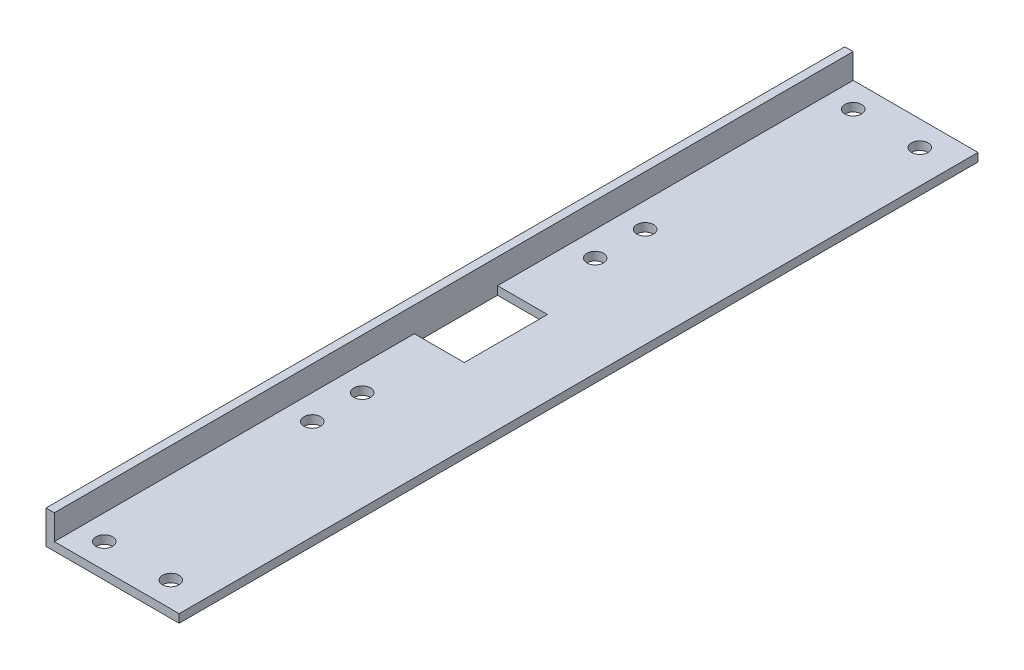
ISO-10303-21;
HEADER;
FILE_DESCRIPTION(('STEP AP214'),'2;1');
FILE_NAME('part.step','',(''),(''),'','','');
FILE_SCHEMA(('AUTOMOTIVE_DESIGN { 1 0 10303 214 1 1 1 1 }'));
ENDSEC;
DATA;
#1=APPLICATION_CONTEXT('core data for automotive mechanical design processes');
#2=APPLICATION_PROTOCOL_DEFINITION('international standard','automotive_design',2000,#1);
#3=PRODUCT_CONTEXT('',#1,'mechanical');
#4=PRODUCT('Part','Part','',(#3));
#5=PRODUCT_RELATED_PRODUCT_CATEGORY('part','',(#4));
#6=PRODUCT_DEFINITION_FORMATION('','',#4);
#7=PRODUCT_DEFINITION_CONTEXT('part definition',#1,'design');
#8=PRODUCT_DEFINITION('design','',#6,#7);
#9=PRODUCT_DEFINITION_SHAPE('','',#8);
#10=(LENGTH_UNIT() NAMED_UNIT(*) SI_UNIT(.MILLI.,.METRE.));
#11=(NAMED_UNIT(*) PLANE_ANGLE_UNIT() SI_UNIT($,.RADIAN.));
#12=(NAMED_UNIT(*) SI_UNIT($,.STERADIAN.) SOLID_ANGLE_UNIT());
#13=UNCERTAINTY_MEASURE_WITH_UNIT(LENGTH_MEASURE(1.E-05),#10,'distance_accuracy_value','');
#14=(GEOMETRIC_REPRESENTATION_CONTEXT(3) GLOBAL_UNCERTAINTY_ASSIGNED_CONTEXT((#13)) GLOBAL_UNIT_ASSIGNED_CONTEXT((#10,
#11,#12)) REPRESENTATION_CONTEXT('',''));
#15=CARTESIAN_POINT('',(0.,0.,0.));
#16=DIRECTION('',(0.,0.,1.));
#17=DIRECTION('',(1.,0.,0.));
#18=AXIS2_PLACEMENT_3D('',#15,#16,#17);
#19=CARTESIAN_POINT('',(3.175,3.17499999999999,304.8));
#20=DIRECTION('',(-1.,0.,0.));
#21=DIRECTION('',(0.,-1.,0.));
#22=AXIS2_PLACEMENT_3D('',#19,#20,#21);
#23=PLANE('',#22);
#24=DIRECTION('',(0.,1.,0.));
#25=VECTOR('',#24,1.);
#26=CARTESIAN_POINT('',(3.175,0.,0.));
#27=LINE('',#26,#25);
#28=CARTESIAN_POINT('',(3.175,3.175,0.));
#29=VERTEX_POINT('',#28);
#30=CARTESIAN_POINT('',(3.175,12.7,0.));
#31=VERTEX_POINT('',#30);
#32=EDGE_CURVE('E139',#29,#31,#27,.T.);
#33=ORIENTED_EDGE('',*,*,#32,.T.);
#34=DIRECTION('',(0.,0.,-1.));
#35=VECTOR('',#34,1.);
#36=CARTESIAN_POINT('',(3.175,12.7,0.));
#37=LINE('',#36,#35);
#38=CARTESIAN_POINT('',(3.175,12.7,304.8));
#39=VERTEX_POINT('',#38);
#40=EDGE_CURVE('E55',#39,#31,#37,.T.);
#41=ORIENTED_EDGE('',*,*,#40,.F.);
#42=DIRECTION('',(0.,1.,0.));
#43=VECTOR('',#42,1.);
#44=CARTESIAN_POINT('',(3.175,0.,304.8));
#45=LINE('',#44,#43);
#46=CARTESIAN_POINT('',(3.175,3.175,304.8));
#47=VERTEX_POINT('',#46);
#48=EDGE_CURVE('E160',#47,#39,#45,.T.);
#49=ORIENTED_EDGE('',*,*,#48,.F.);
#50=DIRECTION('',(0.,0.,1.));
#51=VECTOR('',#50,1.);
#52=CARTESIAN_POINT('',(3.175,3.17499999999999,304.8));
#53=LINE('',#52,#51);
#54=CARTESIAN_POINT('',(3.175,3.17499999999999,167.43393488));
#55=VERTEX_POINT('',#54);
#56=EDGE_CURVE('E168',#47,#55,#53,.F.);
#57=ORIENTED_EDGE('',*,*,#56,.T.);
#58=DIRECTION('',(0.,-1.,0.));
#59=VECTOR('',#58,1.);
#60=CARTESIAN_POINT('',(3.175,25.401,167.43393488));
#61=LINE('',#60,#59);
#62=CARTESIAN_POINT('',(3.175,0.,167.43393488));
#63=VERTEX_POINT('',#62);
#64=EDGE_CURVE('E63',#55,#63,#61,.T.);
#65=ORIENTED_EDGE('',*,*,#64,.T.);
#66=DIRECTION('',(0.,0.,-1.));
#67=VECTOR('',#66,1.);
#68=CARTESIAN_POINT('',(3.175,0.,167.43393488));
#69=LINE('',#68,#67);
#70=CARTESIAN_POINT('',(3.175,0.,135.68393488));
#71=VERTEX_POINT('',#70);
#72=EDGE_CURVE('E337',#63,#71,#69,.T.);
#73=ORIENTED_EDGE('',*,*,#72,.T.);
#74=DIRECTION('',(0.,-1.,0.));
#75=VECTOR('',#74,1.);
#76=CARTESIAN_POINT('',(3.175,25.401,135.68393488));
#77=LINE('',#76,#75);
#78=CARTESIAN_POINT('',(3.175,3.175,135.68393488));
#79=VERTEX_POINT('',#78);
#80=EDGE_CURVE('E310',#79,#71,#77,.T.);
#81=ORIENTED_EDGE('',*,*,#80,.F.);
#82=EDGE_CURVE('E170',#79,#29,#53,.F.);
#83=ORIENTED_EDGE('',*,*,#82,.T.);
#84=EDGE_LOOP('',(#33,#41,#49,#57,#65,#73,#81,#83));
#85=FACE_BOUND('',#84,.T.);
#86=ADVANCED_FACE('F39',(#85),#23,.F.);
#87=CARTESIAN_POINT('',(50.8,3.175,304.8));
#88=DIRECTION('',(0.,-1.,0.));
#89=DIRECTION('',(1.,0.,0.));
#90=AXIS2_PLACEMENT_3D('',#87,#88,#89);
#91=PLANE('',#90);
#92=CARTESIAN_POINT('',(38.1,3.175,295.275));
#93=DIRECTION('',(0.,-1.,0.));
#94=DIRECTION('',(0.,0.,-1.));
#95=AXIS2_PLACEMENT_3D('',#92,#93,#94);
#96=CIRCLE('',#95,3.17499999999998);
#97=CARTESIAN_POINT('',(38.1,3.175,292.1));
#98=VERTEX_POINT('',#97);
#99=EDGE_CURVE('E192',#98,#98,#96,.T.);
#100=ORIENTED_EDGE('',*,*,#99,.T.);
#101=EDGE_LOOP('',(#100));
#102=FACE_BOUND('',#101,.T.);
#103=CARTESIAN_POINT('',(12.7,3.175,295.275));
#104=DIRECTION('',(0.,-1.,0.));
#105=DIRECTION('',(0.,0.,-1.));
#106=AXIS2_PLACEMENT_3D('',#103,#104,#105);
#107=CIRCLE('',#106,3.17499999999998);
#108=CARTESIAN_POINT('',(12.7,3.175,292.1));
#109=VERTEX_POINT('',#108);
#110=EDGE_CURVE('E195',#109,#109,#107,.T.);
#111=ORIENTED_EDGE('',*,*,#110,.T.);
#112=EDGE_LOOP('',(#111));
#113=FACE_BOUND('',#112,.T.);
#114=CARTESIAN_POINT('',(12.7,3.175,196.85));
#115=DIRECTION('',(0.,-1.,0.));
#116=DIRECTION('',(0.,0.,-1.));
#117=AXIS2_PLACEMENT_3D('',#114,#115,#116);
#118=CIRCLE('',#117,3.17500000000001);
#119=CARTESIAN_POINT('',(12.7,3.175,193.675));
#120=VERTEX_POINT('',#119);
#121=EDGE_CURVE('E142',#120,#120,#118,.T.);
#122=ORIENTED_EDGE('',*,*,#121,.T.);
#123=EDGE_LOOP('',(#122));
#124=FACE_BOUND('',#123,.T.);
#125=CARTESIAN_POINT('',(12.7,3.175,215.9));
#126=DIRECTION('',(0.,-1.,0.));
#127=DIRECTION('',(0.,0.,-1.));
#128=AXIS2_PLACEMENT_3D('',#125,#126,#127);
#129=CIRCLE('',#128,3.17500000000001);
#130=CARTESIAN_POINT('',(12.7,3.175,212.725));
#131=VERTEX_POINT('',#130);
#132=EDGE_CURVE('E138',#131,#131,#129,.T.);
#133=ORIENTED_EDGE('',*,*,#132,.T.);
#134=EDGE_LOOP('',(#133));
#135=FACE_BOUND('',#134,.T.);
#136=ORIENTED_EDGE('',*,*,#82,.F.);
#137=DIRECTION('',(-1.,0.,0.));
#138=VECTOR('',#137,1.);
#139=CARTESIAN_POINT('',(3.175,3.17499999999999,135.68393488));
#140=LINE('',#139,#138);
#141=CARTESIAN_POINT('',(22.225,3.175,135.68393488));
#142=VERTEX_POINT('',#141);
#143=EDGE_CURVE('E304',#142,#79,#140,.T.);
#144=ORIENTED_EDGE('',*,*,#143,.F.);
#145=DIRECTION('',(0.,0.,-1.));
#146=VECTOR('',#145,1.);
#147=CARTESIAN_POINT('',(22.225,3.175,167.43393488));
#148=LINE('',#147,#146);
#149=CARTESIAN_POINT('',(22.225,3.175,167.43393488));
#150=VERTEX_POINT('',#149);
#151=EDGE_CURVE('E326',#150,#142,#148,.T.);
#152=ORIENTED_EDGE('',*,*,#151,.F.);
#153=DIRECTION('',(1.,0.,0.));
#154=VECTOR('',#153,1.);
#155=CARTESIAN_POINT('',(3.175,3.17499999999999,167.43393488));
#156=LINE('',#155,#154);
#157=EDGE_CURVE('E306',#55,#150,#156,.T.);
#158=ORIENTED_EDGE('',*,*,#157,.F.);
#159=ORIENTED_EDGE('',*,*,#56,.F.);
#160=DIRECTION('',(1.,0.,0.));
#161=VECTOR('',#160,1.);
#162=CARTESIAN_POINT('',(0.,3.175,304.8));
#163=LINE('',#162,#161);
#164=CARTESIAN_POINT('',(50.8,3.175,304.8));
#165=VERTEX_POINT('',#164);
#166=EDGE_CURVE('E163',#165,#47,#163,.F.);
#167=ORIENTED_EDGE('',*,*,#166,.F.);
#168=DIRECTION('',(0.,0.,1.));
#169=VECTOR('',#168,1.);
#170=CARTESIAN_POINT('',(50.8,3.175,304.8));
#171=LINE('',#170,#169);
#172=CARTESIAN_POINT('',(50.8,3.175,0.));
#173=VERTEX_POINT('',#172);
#174=EDGE_CURVE('E155',#165,#173,#171,.F.);
#175=ORIENTED_EDGE('',*,*,#174,.T.);
#176=DIRECTION('',(1.,0.,0.));
#177=VECTOR('',#176,1.);
#178=CARTESIAN_POINT('',(0.,3.175,0.));
#179=LINE('',#178,#177);
#180=EDGE_CURVE('E144',#173,#29,#179,.F.);
#181=ORIENTED_EDGE('',*,*,#180,.T.);
#182=EDGE_LOOP('',(#136,#144,#152,#158,#159,#167,#175,#181));
#183=FACE_BOUND('',#182,.T.);
#184=CARTESIAN_POINT('',(12.7,3.175,9.525));
#185=DIRECTION('',(0.,-1.,0.));
#186=DIRECTION('',(0.,0.,-1.));
#187=AXIS2_PLACEMENT_3D('',#184,#185,#186);
#188=CIRCLE('',#187,3.175);
#189=CARTESIAN_POINT('',(12.7,3.175,6.35));
#190=VERTEX_POINT('',#189);
#191=EDGE_CURVE('E167',#190,#190,#188,.T.);
#192=ORIENTED_EDGE('',*,*,#191,.T.);
#193=EDGE_LOOP('',(#192));
#194=FACE_BOUND('',#193,.T.);
#195=CARTESIAN_POINT('',(38.1,3.175,9.525));
#196=DIRECTION('',(0.,-1.,0.));
#197=DIRECTION('',(0.,0.,-1.));
#198=AXIS2_PLACEMENT_3D('',#195,#196,#197);
#199=CIRCLE('',#198,3.175);
#200=CARTESIAN_POINT('',(38.1,3.175,6.35000000000001));
#201=VERTEX_POINT('',#200);
#202=EDGE_CURVE('E202',#201,#201,#199,.T.);
#203=ORIENTED_EDGE('',*,*,#202,.T.);
#204=EDGE_LOOP('',(#203));
#205=FACE_BOUND('',#204,.T.);
#206=CARTESIAN_POINT('',(12.7,3.175,107.95));
#207=DIRECTION('',(0.,-1.,0.));
#208=DIRECTION('',(0.,0.,-1.));
#209=AXIS2_PLACEMENT_3D('',#206,#207,#208);
#210=CIRCLE('',#209,3.175);
#211=CARTESIAN_POINT('',(12.7,3.175,104.775));
#212=VERTEX_POINT('',#211);
#213=EDGE_CURVE('E204',#212,#212,#210,.T.);
#214=ORIENTED_EDGE('',*,*,#213,.T.);
#215=EDGE_LOOP('',(#214));
#216=FACE_BOUND('',#215,.T.);
#217=CARTESIAN_POINT('',(12.7,3.175,88.9));
#218=DIRECTION('',(0.,-1.,0.));
#219=DIRECTION('',(0.,0.,-1.));
#220=AXIS2_PLACEMENT_3D('',#217,#218,#219);
#221=CIRCLE('',#220,3.175);
#222=CARTESIAN_POINT('',(12.7,3.175,85.725));
#223=VERTEX_POINT('',#222);
#224=EDGE_CURVE('E42',#223,#223,#221,.T.);
#225=ORIENTED_EDGE('',*,*,#224,.T.);
#226=EDGE_LOOP('',(#225));
#227=FACE_BOUND('',#226,.T.);
#228=ADVANCED_FACE('F211',(#102,#113,#124,#135,#183,#194,#205,#216,#227),#91,.F.);
#229=CARTESIAN_POINT('',(12.7,25.4,88.9));
#230=DIRECTION('',(0.,-1.,0.));
#231=DIRECTION('',(0.,0.,-1.));
#232=AXIS2_PLACEMENT_3D('',#229,#230,#231);
#233=CYLINDRICAL_SURFACE('',#232,3.175);
#234=ORIENTED_EDGE('',*,*,#224,.F.);
#235=EDGE_LOOP('',(#234));
#236=FACE_BOUND('',#235,.T.);
#237=CARTESIAN_POINT('',(12.7,0.,88.9));
#238=DIRECTION('',(0.,-1.,0.));
#239=DIRECTION('',(0.,0.,-1.));
#240=AXIS2_PLACEMENT_3D('',#237,#238,#239);
#241=CIRCLE('',#240,3.175);
#242=CARTESIAN_POINT('',(12.7,0.,85.725));
#243=VERTEX_POINT('',#242);
#244=EDGE_CURVE('E189',#243,#243,#241,.T.);
#245=ORIENTED_EDGE('',*,*,#244,.T.);
#246=EDGE_LOOP('',(#245));
#247=FACE_BOUND('',#246,.T.);
#248=ADVANCED_FACE('F213',(#236,#247),#233,.F.);
#249=CARTESIAN_POINT('',(12.7,25.4,107.95));
#250=DIRECTION('',(0.,-1.,0.));
#251=DIRECTION('',(0.,0.,-1.));
#252=AXIS2_PLACEMENT_3D('',#249,#250,#251);
#253=CYLINDRICAL_SURFACE('',#252,3.175);
#254=ORIENTED_EDGE('',*,*,#213,.F.);
#255=EDGE_LOOP('',(#254));
#256=FACE_BOUND('',#255,.T.);
#257=CARTESIAN_POINT('',(12.7,0.,107.95));
#258=DIRECTION('',(0.,-1.,0.));
#259=DIRECTION('',(0.,0.,-1.));
#260=AXIS2_PLACEMENT_3D('',#257,#258,#259);
#261=CIRCLE('',#260,3.175);
#262=CARTESIAN_POINT('',(12.7,0.,104.775));
#263=VERTEX_POINT('',#262);
#264=EDGE_CURVE('E186',#263,#263,#261,.T.);
#265=ORIENTED_EDGE('',*,*,#264,.T.);
#266=EDGE_LOOP('',(#265));
#267=FACE_BOUND('',#266,.T.);
#268=ADVANCED_FACE('F216',(#256,#267),#253,.F.);
#269=CARTESIAN_POINT('',(38.1,25.4,9.525));
#270=DIRECTION('',(0.,-1.,0.));
#271=DIRECTION('',(0.,0.,-1.));
#272=AXIS2_PLACEMENT_3D('',#269,#270,#271);
#273=CYLINDRICAL_SURFACE('',#272,3.175);
#274=ORIENTED_EDGE('',*,*,#202,.F.);
#275=EDGE_LOOP('',(#274));
#276=FACE_BOUND('',#275,.T.);
#277=CARTESIAN_POINT('',(38.1,0.,9.525));
#278=DIRECTION('',(0.,-1.,0.));
#279=DIRECTION('',(0.,0.,-1.));
#280=AXIS2_PLACEMENT_3D('',#277,#278,#279);
#281=CIRCLE('',#280,3.175);
#282=CARTESIAN_POINT('',(38.1,0.,6.35000000000001));
#283=VERTEX_POINT('',#282);
#284=EDGE_CURVE('E183',#283,#283,#281,.T.);
#285=ORIENTED_EDGE('',*,*,#284,.T.);
#286=EDGE_LOOP('',(#285));
#287=FACE_BOUND('',#286,.T.);
#288=ADVANCED_FACE('F266',(#276,#287),#273,.F.);
#289=CARTESIAN_POINT('',(12.7,25.4,9.525));
#290=DIRECTION('',(0.,-1.,0.));
#291=DIRECTION('',(0.,0.,-1.));
#292=AXIS2_PLACEMENT_3D('',#289,#290,#291);
#293=CYLINDRICAL_SURFACE('',#292,3.175);
#294=ORIENTED_EDGE('',*,*,#191,.F.);
#295=EDGE_LOOP('',(#294));
#296=FACE_BOUND('',#295,.T.);
#297=CARTESIAN_POINT('',(12.7,0.,9.525));
#298=DIRECTION('',(0.,-1.,0.));
#299=DIRECTION('',(0.,0.,-1.));
#300=AXIS2_PLACEMENT_3D('',#297,#298,#299);
#301=CIRCLE('',#300,3.175);
#302=CARTESIAN_POINT('',(12.7,0.,6.35));
#303=VERTEX_POINT('',#302);
#304=EDGE_CURVE('E180',#303,#303,#301,.T.);
#305=ORIENTED_EDGE('',*,*,#304,.T.);
#306=EDGE_LOOP('',(#305));
#307=FACE_BOUND('',#306,.T.);
#308=ADVANCED_FACE('F263',(#296,#307),#293,.F.);
#309=CARTESIAN_POINT('',(0.,25.4,304.8));
#310=DIRECTION('',(1.,0.,0.));
#311=DIRECTION('',(0.,1.,0.));
#312=AXIS2_PLACEMENT_3D('',#309,#310,#311);
#313=PLANE('',#312);
#314=DIRECTION('',(0.,1.,0.));
#315=VECTOR('',#314,1.);
#316=CARTESIAN_POINT('',(0.,0.,304.8));
#317=LINE('',#316,#315);
#318=CARTESIAN_POINT('',(0.,12.7,304.8));
#319=VERTEX_POINT('',#318);
#320=CARTESIAN_POINT('',(0.,0.,304.8));
#321=VERTEX_POINT('',#320);
#322=EDGE_CURVE('E132',#319,#321,#317,.F.);
#323=ORIENTED_EDGE('',*,*,#322,.F.);
#324=DIRECTION('',(0.,0.,1.));
#325=VECTOR('',#324,1.);
#326=CARTESIAN_POINT('',(0.,12.7,0.));
#327=LINE('',#326,#325);
#328=CARTESIAN_POINT('',(0.,12.7,0.));
#329=VERTEX_POINT('',#328);
#330=EDGE_CURVE('E118',#329,#319,#327,.T.);
#331=ORIENTED_EDGE('',*,*,#330,.F.);
#332=DIRECTION('',(0.,1.,0.));
#333=VECTOR('',#332,1.);
#334=CARTESIAN_POINT('',(0.,0.,0.));
#335=LINE('',#334,#333);
#336=CARTESIAN_POINT('',(0.,0.,0.));
#337=VERTEX_POINT('',#336);
#338=EDGE_CURVE('E130',#329,#337,#335,.F.);
#339=ORIENTED_EDGE('',*,*,#338,.T.);
#340=DIRECTION('',(0.,0.,1.));
#341=VECTOR('',#340,1.);
#342=CARTESIAN_POINT('',(0.,0.,304.8));
#343=LINE('',#342,#341);
#344=EDGE_CURVE('E147',#337,#321,#343,.T.);
#345=ORIENTED_EDGE('',*,*,#344,.T.);
#346=EDGE_LOOP('',(#323,#331,#339,#345));
#347=FACE_BOUND('',#346,.T.);
#348=ADVANCED_FACE('F128',(#347),#313,.F.);
#349=CARTESIAN_POINT('',(0.,0.,304.8));
#350=DIRECTION('',(0.,0.,1.));
#351=DIRECTION('',(1.,0.,0.));
#352=AXIS2_PLACEMENT_3D('',#349,#350,#351);
#353=PLANE('',#352);
#354=DIRECTION('',(-1.,0.,0.));
#355=VECTOR('',#354,1.);
#356=CARTESIAN_POINT('',(50.801,12.7,304.8));
#357=LINE('',#356,#355);
#358=EDGE_CURVE('E124',#39,#319,#357,.T.);
#359=ORIENTED_EDGE('',*,*,#358,.T.);
#360=ORIENTED_EDGE('',*,*,#322,.T.);
#361=DIRECTION('',(1.,0.,0.));
#362=VECTOR('',#361,1.);
#363=CARTESIAN_POINT('',(0.,0.,304.8));
#364=LINE('',#363,#362);
#365=CARTESIAN_POINT('',(50.8,0.,304.8));
#366=VERTEX_POINT('',#365);
#367=EDGE_CURVE('E319',#321,#366,#364,.T.);
#368=ORIENTED_EDGE('',*,*,#367,.T.);
#369=DIRECTION('',(0.,1.,0.));
#370=VECTOR('',#369,1.);
#371=CARTESIAN_POINT('',(50.8,0.,304.8));
#372=LINE('',#371,#370);
#373=EDGE_CURVE('E157',#366,#165,#372,.T.);
#374=ORIENTED_EDGE('',*,*,#373,.T.);
#375=ORIENTED_EDGE('',*,*,#166,.T.);
#376=ORIENTED_EDGE('',*,*,#48,.T.);
#377=EDGE_LOOP('',(#359,#360,#368,#374,#375,#376));
#378=FACE_BOUND('',#377,.T.);
#379=ADVANCED_FACE('F256',(#378),#353,.T.);
#380=CARTESIAN_POINT('',(50.8,0.,304.8));
#381=DIRECTION('',(-1.,0.,0.));
#382=DIRECTION('',(0.,0.,1.));
#383=AXIS2_PLACEMENT_3D('',#380,#381,#382);
#384=PLANE('',#383);
#385=ORIENTED_EDGE('',*,*,#174,.F.);
#386=ORIENTED_EDGE('',*,*,#373,.F.);
#387=DIRECTION('',(0.,0.,1.));
#388=VECTOR('',#387,1.);
#389=CARTESIAN_POINT('',(50.8,0.,304.8));
#390=LINE('',#389,#388);
#391=CARTESIAN_POINT('',(50.8,0.,0.));
#392=VERTEX_POINT('',#391);
#393=EDGE_CURVE('E317',#366,#392,#390,.F.);
#394=ORIENTED_EDGE('',*,*,#393,.T.);
#395=DIRECTION('',(0.,1.,0.));
#396=VECTOR('',#395,1.);
#397=CARTESIAN_POINT('',(50.8,0.,0.));
#398=LINE('',#397,#396);
#399=EDGE_CURVE('E152',#392,#173,#398,.T.);
#400=ORIENTED_EDGE('',*,*,#399,.T.);
#401=EDGE_LOOP('',(#385,#386,#394,#400));
#402=FACE_BOUND('',#401,.T.);
#403=ADVANCED_FACE('F253',(#402),#384,.F.);
#404=CARTESIAN_POINT('',(0.,0.,0.));
#405=DIRECTION('',(0.,0.,1.));
#406=DIRECTION('',(1.,0.,0.));
#407=AXIS2_PLACEMENT_3D('',#404,#405,#406);
#408=PLANE('',#407);
#409=ORIENTED_EDGE('',*,*,#338,.F.);
#410=DIRECTION('',(-1.,0.,0.));
#411=VECTOR('',#410,1.);
#412=CARTESIAN_POINT('',(50.801,12.7,0.));
#413=LINE('',#412,#411);
#414=EDGE_CURVE('E115',#31,#329,#413,.T.);
#415=ORIENTED_EDGE('',*,*,#414,.F.);
#416=ORIENTED_EDGE('',*,*,#32,.F.);
#417=ORIENTED_EDGE('',*,*,#180,.F.);
#418=ORIENTED_EDGE('',*,*,#399,.F.);
#419=DIRECTION('',(1.,0.,0.));
#420=VECTOR('',#419,1.);
#421=CARTESIAN_POINT('',(0.,0.,0.));
#422=LINE('',#421,#420);
#423=EDGE_CURVE('E137',#392,#337,#422,.F.);
#424=ORIENTED_EDGE('',*,*,#423,.T.);
#425=EDGE_LOOP('',(#409,#415,#416,#417,#418,#424));
#426=FACE_BOUND('',#425,.T.);
#427=ADVANCED_FACE('F135',(#426),#408,.F.);
#428=CARTESIAN_POINT('',(12.7,25.4,215.9));
#429=DIRECTION('',(0.,-1.,0.));
#430=DIRECTION('',(0.,0.,-1.));
#431=AXIS2_PLACEMENT_3D('',#428,#429,#430);
#432=CYLINDRICAL_SURFACE('',#431,3.17500000000001);
#433=CARTESIAN_POINT('',(12.7,0.,215.9));
#434=DIRECTION('',(0.,-1.,0.));
#435=DIRECTION('',(0.,0.,-1.));
#436=AXIS2_PLACEMENT_3D('',#433,#434,#435);
#437=CIRCLE('',#436,3.17500000000001);
#438=CARTESIAN_POINT('',(12.7,0.,212.725));
#439=VERTEX_POINT('',#438);
#440=EDGE_CURVE('E177',#439,#439,#437,.T.);
#441=ORIENTED_EDGE('',*,*,#440,.T.);
#442=EDGE_LOOP('',(#441));
#443=FACE_BOUND('',#442,.T.);
#444=ORIENTED_EDGE('',*,*,#132,.F.);
#445=EDGE_LOOP('',(#444));
#446=FACE_BOUND('',#445,.T.);
#447=ADVANCED_FACE('F246',(#443,#446),#432,.F.);
#448=CARTESIAN_POINT('',(12.7,25.4,196.85));
#449=DIRECTION('',(0.,-1.,0.));
#450=DIRECTION('',(0.,0.,-1.));
#451=AXIS2_PLACEMENT_3D('',#448,#449,#450);
#452=CYLINDRICAL_SURFACE('',#451,3.17500000000001);
#453=CARTESIAN_POINT('',(12.7,0.,196.85));
#454=DIRECTION('',(0.,-1.,0.));
#455=DIRECTION('',(0.,0.,-1.));
#456=AXIS2_PLACEMENT_3D('',#453,#454,#455);
#457=CIRCLE('',#456,3.17500000000001);
#458=CARTESIAN_POINT('',(12.7,0.,193.675));
#459=VERTEX_POINT('',#458);
#460=EDGE_CURVE('E174',#459,#459,#457,.T.);
#461=ORIENTED_EDGE('',*,*,#460,.T.);
#462=EDGE_LOOP('',(#461));
#463=FACE_BOUND('',#462,.T.);
#464=ORIENTED_EDGE('',*,*,#121,.F.);
#465=EDGE_LOOP('',(#464));
#466=FACE_BOUND('',#465,.T.);
#467=ADVANCED_FACE('F242',(#463,#466),#452,.F.);
#468=CARTESIAN_POINT('',(12.7,25.4,295.275));
#469=DIRECTION('',(0.,-1.,0.));
#470=DIRECTION('',(0.,0.,-1.));
#471=AXIS2_PLACEMENT_3D('',#468,#469,#470);
#472=CYLINDRICAL_SURFACE('',#471,3.17499999999998);
#473=CARTESIAN_POINT('',(12.7,0.,295.275));
#474=DIRECTION('',(0.,-1.,0.));
#475=DIRECTION('',(0.,0.,-1.));
#476=AXIS2_PLACEMENT_3D('',#473,#474,#475);
#477=CIRCLE('',#476,3.17499999999998);
#478=CARTESIAN_POINT('',(12.7,0.,292.1));
#479=VERTEX_POINT('',#478);
#480=EDGE_CURVE('E47',#479,#479,#477,.T.);
#481=ORIENTED_EDGE('',*,*,#480,.T.);
#482=EDGE_LOOP('',(#481));
#483=FACE_BOUND('',#482,.T.);
#484=ORIENTED_EDGE('',*,*,#110,.F.);
#485=EDGE_LOOP('',(#484));
#486=FACE_BOUND('',#485,.T.);
#487=ADVANCED_FACE('F233',(#483,#486),#472,.F.);
#488=CARTESIAN_POINT('',(38.1,25.4,295.275));
#489=DIRECTION('',(0.,-1.,0.));
#490=DIRECTION('',(0.,0.,-1.));
#491=AXIS2_PLACEMENT_3D('',#488,#489,#490);
#492=CYLINDRICAL_SURFACE('',#491,3.17499999999998);
#493=CARTESIAN_POINT('',(38.1,0.,295.275));
#494=DIRECTION('',(0.,-1.,0.));
#495=DIRECTION('',(0.,0.,-1.));
#496=AXIS2_PLACEMENT_3D('',#493,#494,#495);
#497=CIRCLE('',#496,3.17499999999998);
#498=CARTESIAN_POINT('',(38.1,0.,292.1));
#499=VERTEX_POINT('',#498);
#500=EDGE_CURVE('E11',#499,#499,#497,.T.);
#501=ORIENTED_EDGE('',*,*,#500,.T.);
#502=EDGE_LOOP('',(#501));
#503=FACE_BOUND('',#502,.T.);
#504=ORIENTED_EDGE('',*,*,#99,.F.);
#505=EDGE_LOOP('',(#504));
#506=FACE_BOUND('',#505,.T.);
#507=ADVANCED_FACE('F223',(#503,#506),#492,.F.);
#508=CARTESIAN_POINT('',(0.,0.,304.8));
#509=DIRECTION('',(0.,1.,0.));
#510=DIRECTION('',(0.,0.,1.));
#511=AXIS2_PLACEMENT_3D('',#508,#509,#510);
#512=PLANE('',#511);
#513=DIRECTION('',(-1.,0.,0.));
#514=VECTOR('',#513,1.);
#515=CARTESIAN_POINT('',(3.175,0.,167.43393488));
#516=LINE('',#515,#514);
#517=CARTESIAN_POINT('',(22.225,0.,167.43393488));
#518=VERTEX_POINT('',#517);
#519=EDGE_CURVE('E335',#518,#63,#516,.T.);
#520=ORIENTED_EDGE('',*,*,#519,.F.);
#521=DIRECTION('',(0.,0.,1.));
#522=VECTOR('',#521,1.);
#523=CARTESIAN_POINT('',(22.225,0.,167.43393488));
#524=LINE('',#523,#522);
#525=CARTESIAN_POINT('',(22.225,0.,135.68393488));
#526=VERTEX_POINT('',#525);
#527=EDGE_CURVE('E333',#526,#518,#524,.T.);
#528=ORIENTED_EDGE('',*,*,#527,.F.);
#529=DIRECTION('',(1.,0.,0.));
#530=VECTOR('',#529,1.);
#531=CARTESIAN_POINT('',(3.175,0.,135.68393488));
#532=LINE('',#531,#530);
#533=EDGE_CURVE('E340',#71,#526,#532,.T.);
#534=ORIENTED_EDGE('',*,*,#533,.F.);
#535=ORIENTED_EDGE('',*,*,#72,.F.);
#536=EDGE_LOOP('',(#520,#528,#534,#535));
#537=FACE_BOUND('',#536,.T.);
#538=ORIENTED_EDGE('',*,*,#500,.F.);
#539=EDGE_LOOP('',(#538));
#540=FACE_BOUND('',#539,.T.);
#541=ORIENTED_EDGE('',*,*,#480,.F.);
#542=EDGE_LOOP('',(#541));
#543=FACE_BOUND('',#542,.T.);
#544=ORIENTED_EDGE('',*,*,#460,.F.);
#545=EDGE_LOOP('',(#544));
#546=FACE_BOUND('',#545,.T.);
#547=ORIENTED_EDGE('',*,*,#440,.F.);
#548=EDGE_LOOP('',(#547));
#549=FACE_BOUND('',#548,.T.);
#550=ORIENTED_EDGE('',*,*,#393,.F.);
#551=ORIENTED_EDGE('',*,*,#367,.F.);
#552=ORIENTED_EDGE('',*,*,#344,.F.);
#553=ORIENTED_EDGE('',*,*,#423,.F.);
#554=EDGE_LOOP('',(#550,#551,#552,#553));
#555=FACE_BOUND('',#554,.T.);
#556=ORIENTED_EDGE('',*,*,#304,.F.);
#557=EDGE_LOOP('',(#556));
#558=FACE_BOUND('',#557,.T.);
#559=ORIENTED_EDGE('',*,*,#284,.F.);
#560=EDGE_LOOP('',(#559));
#561=FACE_BOUND('',#560,.T.);
#562=ORIENTED_EDGE('',*,*,#264,.F.);
#563=EDGE_LOOP('',(#562));
#564=FACE_BOUND('',#563,.T.);
#565=ORIENTED_EDGE('',*,*,#244,.F.);
#566=EDGE_LOOP('',(#565));
#567=FACE_BOUND('',#566,.T.);
#568=ADVANCED_FACE('F220',(#537,#540,#543,#546,#549,#555,#558,#561,#564,#567),#512,.F.);
#569=CARTESIAN_POINT('',(22.225,25.401,167.43393488));
#570=DIRECTION('',(1.,0.,0.));
#571=DIRECTION('',(0.,0.,-1.));
#572=AXIS2_PLACEMENT_3D('',#569,#570,#571);
#573=PLANE('',#572);
#574=ORIENTED_EDGE('',*,*,#151,.T.);
#575=DIRECTION('',(0.,-1.,0.));
#576=VECTOR('',#575,1.);
#577=CARTESIAN_POINT('',(22.225,25.401,135.68393488));
#578=LINE('',#577,#576);
#579=EDGE_CURVE('E307',#142,#526,#578,.T.);
#580=ORIENTED_EDGE('',*,*,#579,.T.);
#581=ORIENTED_EDGE('',*,*,#527,.T.);
#582=DIRECTION('',(0.,-1.,0.));
#583=VECTOR('',#582,1.);
#584=CARTESIAN_POINT('',(22.225,25.401,167.43393488));
#585=LINE('',#584,#583);
#586=EDGE_CURVE('E314',#150,#518,#585,.T.);
#587=ORIENTED_EDGE('',*,*,#586,.F.);
#588=EDGE_LOOP('',(#574,#580,#581,#587));
#589=FACE_BOUND('',#588,.T.);
#590=ADVANCED_FACE('F222',(#589),#573,.F.);
#591=CARTESIAN_POINT('',(3.175,25.401,135.68393488));
#592=DIRECTION('',(0.,0.,-1.));
#593=DIRECTION('',(-1.,0.,0.));
#594=AXIS2_PLACEMENT_3D('',#591,#592,#593);
#595=PLANE('',#594);
#596=ORIENTED_EDGE('',*,*,#143,.T.);
#597=ORIENTED_EDGE('',*,*,#80,.T.);
#598=ORIENTED_EDGE('',*,*,#533,.T.);
#599=ORIENTED_EDGE('',*,*,#579,.F.);
#600=EDGE_LOOP('',(#596,#597,#598,#599));
#601=FACE_BOUND('',#600,.T.);
#602=ADVANCED_FACE('F230',(#601),#595,.F.);
#603=CARTESIAN_POINT('',(3.175,25.401,167.43393488));
#604=DIRECTION('',(0.,0.,1.));
#605=DIRECTION('',(1.,0.,0.));
#606=AXIS2_PLACEMENT_3D('',#603,#604,#605);
#607=PLANE('',#606);
#608=ORIENTED_EDGE('',*,*,#157,.T.);
#609=ORIENTED_EDGE('',*,*,#586,.T.);
#610=ORIENTED_EDGE('',*,*,#519,.T.);
#611=ORIENTED_EDGE('',*,*,#64,.F.);
#612=EDGE_LOOP('',(#608,#609,#610,#611));
#613=FACE_BOUND('',#612,.T.);
#614=ADVANCED_FACE('F343',(#613),#607,.F.);
#615=CARTESIAN_POINT('',(50.801,12.7,0.));
#616=DIRECTION('',(0.,-1.,0.));
#617=DIRECTION('',(1.,0.,0.));
#618=AXIS2_PLACEMENT_3D('',#615,#616,#617);
#619=PLANE('',#618);
#620=ORIENTED_EDGE('',*,*,#40,.T.);
#621=ORIENTED_EDGE('',*,*,#414,.T.);
#622=ORIENTED_EDGE('',*,*,#330,.T.);
#623=ORIENTED_EDGE('',*,*,#358,.F.);
#624=EDGE_LOOP('',(#620,#621,#622,#623));
#625=FACE_BOUND('',#624,.T.);
#626=ADVANCED_FACE('F117',(#625),#619,.F.);
#627=CLOSED_SHELL('',(#86,#228,#248,#268,#288,#308,#348,#379,#403,#427,#447,#467,#487,#507,#568,
#590,#602,#614,#626));
#628=MANIFOLD_SOLID_BREP('B2',#627);
#629=ADVANCED_BREP_SHAPE_REPRESENTATION('',(#18,#628),#14);
#630=SHAPE_DEFINITION_REPRESENTATION(#9,#629);
ENDSEC;
END-ISO-10303-21;
